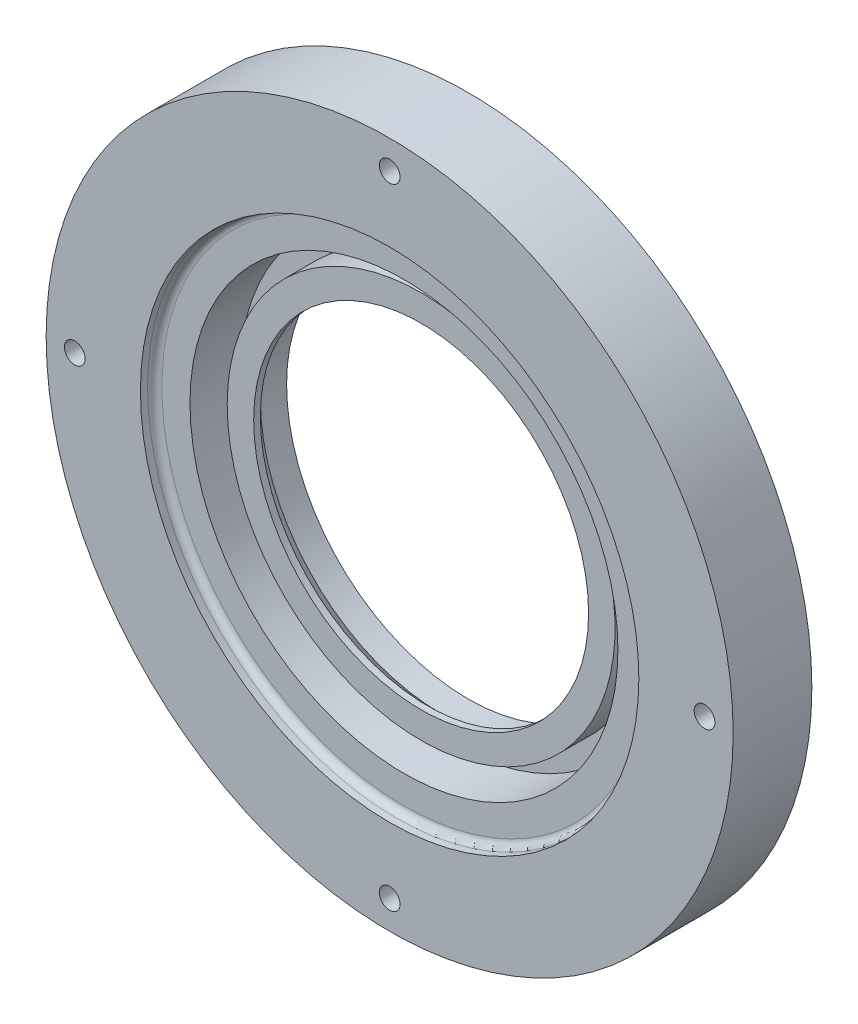
ISO-10303-21;
HEADER;
FILE_DESCRIPTION(('STEP AP214'),'2;1');
FILE_NAME('part.step','',(''),(''),'','','');
FILE_SCHEMA(('AUTOMOTIVE_DESIGN { 1 0 10303 214 1 1 1 1 }'));
ENDSEC;
DATA;
#1=APPLICATION_CONTEXT('core data for automotive mechanical design processes');
#2=APPLICATION_PROTOCOL_DEFINITION('international standard','automotive_design',2000,#1);
#3=PRODUCT_CONTEXT('',#1,'mechanical');
#4=PRODUCT('Part','Part','',(#3));
#5=PRODUCT_RELATED_PRODUCT_CATEGORY('part','',(#4));
#6=PRODUCT_DEFINITION_FORMATION('','',#4);
#7=PRODUCT_DEFINITION_CONTEXT('part definition',#1,'design');
#8=PRODUCT_DEFINITION('design','',#6,#7);
#9=PRODUCT_DEFINITION_SHAPE('','',#8);
#10=(LENGTH_UNIT() NAMED_UNIT(*) SI_UNIT(.MILLI.,.METRE.));
#11=(NAMED_UNIT(*) PLANE_ANGLE_UNIT() SI_UNIT($,.RADIAN.));
#12=(NAMED_UNIT(*) SI_UNIT($,.STERADIAN.) SOLID_ANGLE_UNIT());
#13=UNCERTAINTY_MEASURE_WITH_UNIT(LENGTH_MEASURE(1.E-05),#10,'distance_accuracy_value','');
#14=(GEOMETRIC_REPRESENTATION_CONTEXT(3) GLOBAL_UNCERTAINTY_ASSIGNED_CONTEXT((#13)) GLOBAL_UNIT_ASSIGNED_CONTEXT((#10,
#11,#12)) REPRESENTATION_CONTEXT('',''));
#15=CARTESIAN_POINT('',(0.,0.,0.));
#16=DIRECTION('',(0.,0.,1.));
#17=DIRECTION('',(1.,0.,0.));
#18=AXIS2_PLACEMENT_3D('',#15,#16,#17);
#19=CARTESIAN_POINT('',(127.528436791255,216.657330079598,-144.929295826493));
#20=DIRECTION('',(0.,0.,1.));
#21=DIRECTION('',(1.,0.,0.));
#22=AXIS2_PLACEMENT_3D('',#19,#20,#21);
#23=PLANE('',#22);
#24=CARTESIAN_POINT('',(149.116436893732,233.0392790349,-144.929295826493));
#25=DIRECTION('',(0.,0.,-1.));
#26=DIRECTION('',(-1.,0.,0.));
#27=AXIS2_PLACEMENT_3D('',#24,#25,#26);
#28=CIRCLE('',#27,23.3999999999755);
#29=CARTESIAN_POINT('',(125.716436893756,233.0392790349,-144.929295826493));
#30=VERTEX_POINT('',#29);
#31=EDGE_CURVE('E42',#30,#30,#28,.T.);
#32=ORIENTED_EDGE('',*,*,#31,.T.);
#33=EDGE_LOOP('',(#32));
#34=FACE_BOUND('',#33,.T.);
#35=CARTESIAN_POINT('',(149.116436893732,233.0392790349,-144.929295826493));
#36=DIRECTION('',(0.,0.,-1.));
#37=DIRECTION('',(-1.,0.,0.));
#38=AXIS2_PLACEMENT_3D('',#35,#36,#37);
#39=CIRCLE('',#38,27.0999999999755);
#40=CARTESIAN_POINT('',(122.016436893756,233.0392790349,-144.929295826493));
#41=VERTEX_POINT('',#40);
#42=EDGE_CURVE('E75',#41,#41,#39,.T.);
#43=ORIENTED_EDGE('',*,*,#42,.F.);
#44=EDGE_LOOP('',(#43));
#45=FACE_BOUND('',#44,.T.);
#46=ADVANCED_FACE('F31',(#34,#45),#23,.T.);
#47=CARTESIAN_POINT('',(149.116436893732,233.0392790349,-155.970002236656));
#48=DIRECTION('',(0.,0.,-1.));
#49=DIRECTION('',(-1.,0.,0.));
#50=AXIS2_PLACEMENT_3D('',#47,#48,#49);
#51=CYLINDRICAL_SURFACE('',#50,23.3999999999755);
#52=CARTESIAN_POINT('',(149.116436893732,233.0392790349,-145.863610401519));
#53=DIRECTION('',(0.,0.,-1.));
#54=DIRECTION('',(-1.,0.,0.));
#55=AXIS2_PLACEMENT_3D('',#52,#53,#54);
#56=CIRCLE('',#55,23.3999999999755);
#57=CARTESIAN_POINT('',(125.716436893756,233.0392790349,-145.863610401519));
#58=VERTEX_POINT('',#57);
#59=EDGE_CURVE('E46',#58,#58,#56,.T.);
#60=ORIENTED_EDGE('',*,*,#59,.T.);
#61=EDGE_LOOP('',(#60));
#62=FACE_BOUND('',#61,.T.);
#63=ORIENTED_EDGE('',*,*,#31,.F.);
#64=EDGE_LOOP('',(#63));
#65=FACE_BOUND('',#64,.T.);
#66=ADVANCED_FACE('F153',(#62,#65),#51,.F.);
#67=CARTESIAN_POINT('',(149.116436893732,233.0392790349,-145.863610401519));
#68=DIRECTION('',(0.,0.,-1.));
#69=DIRECTION('',(-1.,0.,0.));
#70=AXIS2_PLACEMENT_3D('',#67,#68,#69);
#71=CONICAL_SURFACE('',#70,23.3999999999755,0.785398163397448);
#72=CARTESIAN_POINT('',(149.116436893732,233.0392790349,-147.863610401544));
#73=DIRECTION('',(0.,0.,-1.));
#74=DIRECTION('',(-1.,0.,0.));
#75=AXIS2_PLACEMENT_3D('',#72,#73,#74);
#76=CIRCLE('',#75,25.4);
#77=CARTESIAN_POINT('',(123.716436893732,233.0392790349,-147.863610401544));
#78=VERTEX_POINT('',#77);
#79=EDGE_CURVE('E51',#78,#78,#76,.T.);
#80=ORIENTED_EDGE('',*,*,#79,.T.);
#81=EDGE_LOOP('',(#80));
#82=FACE_BOUND('',#81,.T.);
#83=ORIENTED_EDGE('',*,*,#59,.F.);
#84=EDGE_LOOP('',(#83));
#85=FACE_BOUND('',#84,.T.);
#86=ADVANCED_FACE('F147',(#82,#85),#71,.F.);
#87=CARTESIAN_POINT('',(149.116436893732,233.0392790349,-155.970002236656));
#88=DIRECTION('',(0.,0.,-1.));
#89=DIRECTION('',(-1.,0.,0.));
#90=AXIS2_PLACEMENT_3D('',#87,#88,#89);
#91=CYLINDRICAL_SURFACE('',#90,25.4);
#92=CARTESIAN_POINT('',(149.116436893732,233.0392790349,-151.529295826493));
#93=DIRECTION('',(0.,0.,-1.));
#94=DIRECTION('',(-1.,0.,0.));
#95=AXIS2_PLACEMENT_3D('',#92,#93,#94);
#96=CIRCLE('',#95,25.4);
#97=CARTESIAN_POINT('',(123.716436893732,233.0392790349,-151.529295826493));
#98=VERTEX_POINT('',#97);
#99=EDGE_CURVE('E54',#98,#98,#96,.T.);
#100=ORIENTED_EDGE('',*,*,#99,.T.);
#101=EDGE_LOOP('',(#100));
#102=FACE_BOUND('',#101,.T.);
#103=ORIENTED_EDGE('',*,*,#79,.F.);
#104=EDGE_LOOP('',(#103));
#105=FACE_BOUND('',#104,.T.);
#106=ADVANCED_FACE('F133',(#102,#105),#91,.F.);
#107=CARTESIAN_POINT('',(128.882665579953,217.68498001405,-151.529295826493));
#108=DIRECTION('',(0.,0.,-1.));
#109=DIRECTION('',(-1.,0.,0.));
#110=AXIS2_PLACEMENT_3D('',#107,#108,#109);
#111=PLANE('',#110);
#112=CARTESIAN_POINT('',(149.116436893732,277.0392790349,-151.529295826493));
#113=DIRECTION('',(0.,0.,-1.));
#114=DIRECTION('',(-1.,0.,0.));
#115=AXIS2_PLACEMENT_3D('',#112,#113,#114);
#116=CIRCLE('',#115,2.75);
#117=CARTESIAN_POINT('',(146.366436893732,277.0392790349,-151.529295826493));
#118=VERTEX_POINT('',#117);
#119=EDGE_CURVE('E123',#118,#118,#116,.T.);
#120=ORIENTED_EDGE('',*,*,#119,.F.);
#121=EDGE_LOOP('',(#120));
#122=FACE_BOUND('',#121,.T.);
#123=CARTESIAN_POINT('',(149.116436893732,189.0392790349,-151.529295826493));
#124=DIRECTION('',(0.,0.,-1.));
#125=DIRECTION('',(-1.,0.,0.));
#126=AXIS2_PLACEMENT_3D('',#123,#124,#125);
#127=CIRCLE('',#126,2.75);
#128=CARTESIAN_POINT('',(146.366436893732,189.0392790349,-151.529295826493));
#129=VERTEX_POINT('',#128);
#130=EDGE_CURVE('E111',#129,#129,#127,.T.);
#131=ORIENTED_EDGE('',*,*,#130,.F.);
#132=EDGE_LOOP('',(#131));
#133=FACE_BOUND('',#132,.T.);
#134=CARTESIAN_POINT('',(105.116436893732,233.0392790349,-151.529295826493));
#135=DIRECTION('',(0.,0.,-1.));
#136=DIRECTION('',(-1.,0.,0.));
#137=AXIS2_PLACEMENT_3D('',#134,#135,#136);
#138=CIRCLE('',#137,2.75);
#139=CARTESIAN_POINT('',(102.366436893732,233.0392790349,-151.529295826493));
#140=VERTEX_POINT('',#139);
#141=EDGE_CURVE('E99',#140,#140,#138,.T.);
#142=ORIENTED_EDGE('',*,*,#141,.F.);
#143=EDGE_LOOP('',(#142));
#144=FACE_BOUND('',#143,.T.);
#145=CARTESIAN_POINT('',(193.116436893732,233.0392790349,-151.529295826493));
#146=DIRECTION('',(0.,0.,-1.));
#147=DIRECTION('',(-1.,0.,0.));
#148=AXIS2_PLACEMENT_3D('',#145,#146,#147);
#149=CIRCLE('',#148,2.75);
#150=CARTESIAN_POINT('',(190.366436893732,233.0392790349,-151.529295826493));
#151=VERTEX_POINT('',#150);
#152=EDGE_CURVE('E87',#151,#151,#149,.T.);
#153=ORIENTED_EDGE('',*,*,#152,.F.);
#154=EDGE_LOOP('',(#153));
#155=FACE_BOUND('',#154,.T.);
#156=CARTESIAN_POINT('',(149.116436893732,233.0392790349,-151.529295826493));
#157=DIRECTION('',(0.,0.,-1.));
#158=DIRECTION('',(-1.,0.,0.));
#159=AXIS2_PLACEMENT_3D('',#156,#157,#158);
#160=CIRCLE('',#159,48.);
#161=CARTESIAN_POINT('',(101.116436893732,233.0392790349,-151.529295826493));
#162=VERTEX_POINT('',#161);
#163=EDGE_CURVE('E57',#162,#162,#160,.T.);
#164=ORIENTED_EDGE('',*,*,#163,.T.);
#165=EDGE_LOOP('',(#164));
#166=FACE_BOUND('',#165,.T.);
#167=ORIENTED_EDGE('',*,*,#99,.F.);
#168=EDGE_LOOP('',(#167));
#169=FACE_BOUND('',#168,.T.);
#170=ADVANCED_FACE('F129',(#122,#133,#144,#155,#166,#169),#111,.T.);
#171=CARTESIAN_POINT('',(149.116436893732,233.0392790349,-155.970002236656));
#172=DIRECTION('',(0.,0.,-1.));
#173=DIRECTION('',(-1.,0.,0.));
#174=AXIS2_PLACEMENT_3D('',#171,#172,#173);
#175=CYLINDRICAL_SURFACE('',#174,48.);
#176=CARTESIAN_POINT('',(149.116436893732,233.0392790349,-140.529295826493));
#177=DIRECTION('',(0.,0.,-1.));
#178=DIRECTION('',(-1.,0.,0.));
#179=AXIS2_PLACEMENT_3D('',#176,#177,#178);
#180=CIRCLE('',#179,48.);
#181=CARTESIAN_POINT('',(101.116436893732,233.0392790349,-140.529295826493));
#182=VERTEX_POINT('',#181);
#183=EDGE_CURVE('E60',#182,#182,#180,.T.);
#184=ORIENTED_EDGE('',*,*,#183,.T.);
#185=EDGE_LOOP('',(#184));
#186=FACE_BOUND('',#185,.T.);
#187=ORIENTED_EDGE('',*,*,#163,.F.);
#188=EDGE_LOOP('',(#187));
#189=FACE_BOUND('',#188,.T.);
#190=ADVANCED_FACE('F132',(#186,#189),#175,.T.);
#191=CARTESIAN_POINT('',(110.879388741709,204.023280885261,-140.529295826493));
#192=DIRECTION('',(0.,0.,1.));
#193=DIRECTION('',(1.,0.,0.));
#194=AXIS2_PLACEMENT_3D('',#191,#192,#193);
#195=PLANE('',#194);
#196=CARTESIAN_POINT('',(149.116436893732,277.0392790349,-140.529295826493));
#197=DIRECTION('',(0.,0.,-1.));
#198=DIRECTION('',(-1.,0.,0.));
#199=AXIS2_PLACEMENT_3D('',#196,#197,#198);
#200=CIRCLE('',#199,1.45000000000001);
#201=CARTESIAN_POINT('',(147.666436893732,277.0392790349,-140.529295826493));
#202=VERTEX_POINT('',#201);
#203=EDGE_CURVE('E114',#202,#202,#200,.T.);
#204=ORIENTED_EDGE('',*,*,#203,.T.);
#205=EDGE_LOOP('',(#204));
#206=FACE_BOUND('',#205,.T.);
#207=CARTESIAN_POINT('',(149.116436893732,189.0392790349,-140.529295826493));
#208=DIRECTION('',(0.,0.,-1.));
#209=DIRECTION('',(-1.,0.,0.));
#210=AXIS2_PLACEMENT_3D('',#207,#208,#209);
#211=CIRCLE('',#210,1.45000000000001);
#212=CARTESIAN_POINT('',(147.666436893732,189.0392790349,-140.529295826493));
#213=VERTEX_POINT('',#212);
#214=EDGE_CURVE('E102',#213,#213,#211,.T.);
#215=ORIENTED_EDGE('',*,*,#214,.T.);
#216=EDGE_LOOP('',(#215));
#217=FACE_BOUND('',#216,.T.);
#218=CARTESIAN_POINT('',(105.116436893732,233.0392790349,-140.529295826493));
#219=DIRECTION('',(0.,0.,-1.));
#220=DIRECTION('',(-1.,0.,0.));
#221=AXIS2_PLACEMENT_3D('',#218,#219,#220);
#222=CIRCLE('',#221,1.44999999999999);
#223=CARTESIAN_POINT('',(103.666436893732,233.0392790349,-140.529295826493));
#224=VERTEX_POINT('',#223);
#225=EDGE_CURVE('E90',#224,#224,#222,.T.);
#226=ORIENTED_EDGE('',*,*,#225,.T.);
#227=EDGE_LOOP('',(#226));
#228=FACE_BOUND('',#227,.T.);
#229=CARTESIAN_POINT('',(193.116436893732,233.0392790349,-140.529295826493));
#230=DIRECTION('',(0.,0.,-1.));
#231=DIRECTION('',(-1.,0.,0.));
#232=AXIS2_PLACEMENT_3D('',#229,#230,#231);
#233=CIRCLE('',#232,1.45000000000001);
#234=CARTESIAN_POINT('',(191.666436893732,233.0392790349,-140.529295826493));
#235=VERTEX_POINT('',#234);
#236=EDGE_CURVE('E78',#235,#235,#233,.T.);
#237=ORIENTED_EDGE('',*,*,#236,.T.);
#238=EDGE_LOOP('',(#237));
#239=FACE_BOUND('',#238,.T.);
#240=CARTESIAN_POINT('',(149.116436893732,233.0392790349,-140.529295826493));
#241=DIRECTION('',(0.,0.,-1.));
#242=DIRECTION('',(-1.,0.,0.));
#243=AXIS2_PLACEMENT_3D('',#240,#241,#242);
#244=CIRCLE('',#243,34.825);
#245=CARTESIAN_POINT('',(114.291436893732,233.0392790349,-140.529295826493));
#246=VERTEX_POINT('',#245);
#247=EDGE_CURVE('E63',#246,#246,#244,.T.);
#248=ORIENTED_EDGE('',*,*,#247,.T.);
#249=EDGE_LOOP('',(#248));
#250=FACE_BOUND('',#249,.T.);
#251=ORIENTED_EDGE('',*,*,#183,.F.);
#252=EDGE_LOOP('',(#251));
#253=FACE_BOUND('',#252,.T.);
#254=ADVANCED_FACE('F191',(#206,#217,#228,#239,#250,#253),#195,.T.);
#255=CARTESIAN_POINT('',(149.116436893732,233.0392790349,-155.970002236656));
#256=DIRECTION('',(0.,0.,-1.));
#257=DIRECTION('',(-1.,0.,0.));
#258=AXIS2_PLACEMENT_3D('',#255,#256,#257);
#259=CYLINDRICAL_SURFACE('',#258,34.825);
#260=CARTESIAN_POINT('',(149.116436893732,233.0392790349,-141.529295826493));
#261=DIRECTION('',(0.,0.,1.));
#262=DIRECTION('',(1.,0.,0.));
#263=AXIS2_PLACEMENT_3D('',#260,#261,#262);
#264=CIRCLE('',#263,34.825);
#265=CARTESIAN_POINT('',(183.941436893732,233.0392790349,-141.529295826493));
#266=VERTEX_POINT('',#265);
#267=EDGE_CURVE('E38',#266,#266,#264,.F.);
#268=ORIENTED_EDGE('',*,*,#267,.T.);
#269=EDGE_LOOP('',(#268));
#270=FACE_BOUND('',#269,.T.);
#271=ORIENTED_EDGE('',*,*,#247,.F.);
#272=EDGE_LOOP('',(#271));
#273=FACE_BOUND('',#272,.T.);
#274=ADVANCED_FACE('F186',(#270,#273),#259,.F.);
#275=CARTESIAN_POINT('',(121.374661854269,211.987567877376,-142.529295826493));
#276=DIRECTION('',(0.,0.,1.));
#277=DIRECTION('',(1.,0.,0.));
#278=AXIS2_PLACEMENT_3D('',#275,#276,#277);
#279=PLANE('',#278);
#280=CARTESIAN_POINT('',(149.116436893732,233.0392790349,-142.529295826493));
#281=DIRECTION('',(0.,0.,1.));
#282=DIRECTION('',(1.,0.,0.));
#283=AXIS2_PLACEMENT_3D('',#280,#281,#282);
#284=CIRCLE('',#283,33.825);
#285=CARTESIAN_POINT('',(182.941436893732,233.0392790349,-142.529295826493));
#286=VERTEX_POINT('',#285);
#287=EDGE_CURVE('E10',#286,#286,#284,.T.);
#288=ORIENTED_EDGE('',*,*,#287,.T.);
#289=EDGE_LOOP('',(#288));
#290=FACE_BOUND('',#289,.T.);
#291=CARTESIAN_POINT('',(149.116436893732,233.0392790349,-142.529295826493));
#292=DIRECTION('',(0.,0.,-1.));
#293=DIRECTION('',(-1.,0.,0.));
#294=AXIS2_PLACEMENT_3D('',#291,#292,#293);
#295=CIRCLE('',#294,29.8999999999755);
#296=CARTESIAN_POINT('',(119.216436893756,233.0392790349,-142.529295826493));
#297=VERTEX_POINT('',#296);
#298=EDGE_CURVE('E66',#297,#297,#295,.T.);
#299=ORIENTED_EDGE('',*,*,#298,.T.);
#300=EDGE_LOOP('',(#299));
#301=FACE_BOUND('',#300,.T.);
#302=ADVANCED_FACE('F181',(#290,#301),#279,.T.);
#303=CARTESIAN_POINT('',(149.116436893732,233.0392790349,-155.970002236656));
#304=DIRECTION('',(0.,0.,-1.));
#305=DIRECTION('',(-1.,0.,0.));
#306=AXIS2_PLACEMENT_3D('',#303,#304,#305);
#307=CYLINDRICAL_SURFACE('',#306,29.8999999999755);
#308=CARTESIAN_POINT('',(149.116436893732,233.0392790349,-149.529295826493));
#309=DIRECTION('',(0.,0.,-1.));
#310=DIRECTION('',(-1.,0.,0.));
#311=AXIS2_PLACEMENT_3D('',#308,#309,#310);
#312=CIRCLE('',#311,29.8999999999755);
#313=CARTESIAN_POINT('',(119.216436893756,233.0392790349,-149.529295826493));
#314=VERTEX_POINT('',#313);
#315=EDGE_CURVE('E69',#314,#314,#312,.T.);
#316=ORIENTED_EDGE('',*,*,#315,.T.);
#317=EDGE_LOOP('',(#316));
#318=FACE_BOUND('',#317,.T.);
#319=ORIENTED_EDGE('',*,*,#298,.F.);
#320=EDGE_LOOP('',(#319));
#321=FACE_BOUND('',#320,.T.);
#322=ADVANCED_FACE('F175',(#318,#321),#307,.F.);
#323=CARTESIAN_POINT('',(127.528436791255,216.657330079598,-149.529295826493));
#324=DIRECTION('',(0.,0.,1.));
#325=DIRECTION('',(1.,0.,0.));
#326=AXIS2_PLACEMENT_3D('',#323,#324,#325);
#327=PLANE('',#326);
#328=CARTESIAN_POINT('',(149.116436893732,233.0392790349,-149.529295826493));
#329=DIRECTION('',(0.,0.,-1.));
#330=DIRECTION('',(-1.,0.,0.));
#331=AXIS2_PLACEMENT_3D('',#328,#329,#330);
#332=CIRCLE('',#331,27.0999999999755);
#333=CARTESIAN_POINT('',(122.016436893756,233.0392790349,-149.529295826493));
#334=VERTEX_POINT('',#333);
#335=EDGE_CURVE('E72',#334,#334,#332,.T.);
#336=ORIENTED_EDGE('',*,*,#335,.T.);
#337=EDGE_LOOP('',(#336));
#338=FACE_BOUND('',#337,.T.);
#339=ORIENTED_EDGE('',*,*,#315,.F.);
#340=EDGE_LOOP('',(#339));
#341=FACE_BOUND('',#340,.T.);
#342=ADVANCED_FACE('F169',(#338,#341),#327,.T.);
#343=CARTESIAN_POINT('',(149.116436893732,233.0392790349,-155.970002236656));
#344=DIRECTION('',(0.,0.,-1.));
#345=DIRECTION('',(-1.,0.,0.));
#346=AXIS2_PLACEMENT_3D('',#343,#344,#345);
#347=CYLINDRICAL_SURFACE('',#346,27.0999999999755);
#348=ORIENTED_EDGE('',*,*,#42,.T.);
#349=EDGE_LOOP('',(#348));
#350=FACE_BOUND('',#349,.T.);
#351=ORIENTED_EDGE('',*,*,#335,.F.);
#352=EDGE_LOOP('',(#351));
#353=FACE_BOUND('',#352,.T.);
#354=ADVANCED_FACE('F166',(#350,#353),#347,.T.);
#355=CARTESIAN_POINT('',(149.116436893732,233.0392790349,-141.529295826493));
#356=DIRECTION('',(0.,0.,1.));
#357=DIRECTION('',(1.,0.,0.));
#358=AXIS2_PLACEMENT_3D('',#355,#356,#357);
#359=TOROIDAL_SURFACE('',#358,33.825,1.);
#360=ORIENTED_EDGE('',*,*,#287,.F.);
#361=EDGE_LOOP('',(#360));
#362=FACE_BOUND('',#361,.T.);
#363=ORIENTED_EDGE('',*,*,#267,.F.);
#364=EDGE_LOOP('',(#363));
#365=FACE_BOUND('',#364,.T.);
#366=ADVANCED_FACE('F33',(#362,#365),#359,.F.);
#367=CARTESIAN_POINT('',(193.116436893732,233.0392790349,-151.529295826493));
#368=DIRECTION('',(0.,0.,-1.));
#369=DIRECTION('',(-1.,0.,0.));
#370=AXIS2_PLACEMENT_3D('',#367,#368,#369);
#371=CYLINDRICAL_SURFACE('',#370,1.45000000000001);
#372=ORIENTED_EDGE('',*,*,#236,.F.);
#373=EDGE_LOOP('',(#372));
#374=FACE_BOUND('',#373,.T.);
#375=CARTESIAN_POINT('',(193.116436893732,233.0392790349,-146.029295826493));
#376=DIRECTION('',(0.,0.,-1.));
#377=DIRECTION('',(-1.,0.,0.));
#378=AXIS2_PLACEMENT_3D('',#375,#376,#377);
#379=CIRCLE('',#378,1.45000000000001);
#380=CARTESIAN_POINT('',(191.666436893732,233.0392790349,-146.029295826493));
#381=VERTEX_POINT('',#380);
#382=EDGE_CURVE('E81',#381,#381,#379,.T.);
#383=ORIENTED_EDGE('',*,*,#382,.T.);
#384=EDGE_LOOP('',(#383));
#385=FACE_BOUND('',#384,.T.);
#386=ADVANCED_FACE('F234',(#374,#385),#371,.F.);
#387=CARTESIAN_POINT('',(194.566436893732,233.0392790349,-146.029295826493));
#388=DIRECTION('',(0.,0.,1.));
#389=DIRECTION('',(1.,0.,0.));
#390=AXIS2_PLACEMENT_3D('',#387,#388,#389);
#391=PLANE('',#390);
#392=ORIENTED_EDGE('',*,*,#382,.F.);
#393=EDGE_LOOP('',(#392));
#394=FACE_BOUND('',#393,.T.);
#395=CARTESIAN_POINT('',(193.116436893732,233.0392790349,-146.029295826493));
#396=DIRECTION('',(0.,0.,-1.));
#397=DIRECTION('',(-1.,0.,0.));
#398=AXIS2_PLACEMENT_3D('',#395,#396,#397);
#399=CIRCLE('',#398,2.75);
#400=CARTESIAN_POINT('',(190.366436893732,233.0392790349,-146.029295826493));
#401=VERTEX_POINT('',#400);
#402=EDGE_CURVE('E84',#401,#401,#399,.T.);
#403=ORIENTED_EDGE('',*,*,#402,.T.);
#404=EDGE_LOOP('',(#403));
#405=FACE_BOUND('',#404,.T.);
#406=ADVANCED_FACE('F275',(#394,#405),#391,.F.);
#407=CARTESIAN_POINT('',(193.116436893732,233.0392790349,-151.529295826493));
#408=DIRECTION('',(0.,0.,-1.));
#409=DIRECTION('',(-1.,0.,0.));
#410=AXIS2_PLACEMENT_3D('',#407,#408,#409);
#411=CYLINDRICAL_SURFACE('',#410,2.75);
#412=ORIENTED_EDGE('',*,*,#402,.F.);
#413=EDGE_LOOP('',(#412));
#414=FACE_BOUND('',#413,.T.);
#415=ORIENTED_EDGE('',*,*,#152,.T.);
#416=EDGE_LOOP('',(#415));
#417=FACE_BOUND('',#416,.T.);
#418=ADVANCED_FACE('F282',(#414,#417),#411,.F.);
#419=CARTESIAN_POINT('',(105.116436893732,233.0392790349,-151.529295826493));
#420=DIRECTION('',(0.,0.,-1.));
#421=DIRECTION('',(-1.,0.,0.));
#422=AXIS2_PLACEMENT_3D('',#419,#420,#421);
#423=CYLINDRICAL_SURFACE('',#422,1.44999999999999);
#424=ORIENTED_EDGE('',*,*,#225,.F.);
#425=EDGE_LOOP('',(#424));
#426=FACE_BOUND('',#425,.T.);
#427=CARTESIAN_POINT('',(105.116436893732,233.0392790349,-146.029295826493));
#428=DIRECTION('',(0.,0.,-1.));
#429=DIRECTION('',(-1.,0.,0.));
#430=AXIS2_PLACEMENT_3D('',#427,#428,#429);
#431=CIRCLE('',#430,1.44999999999999);
#432=CARTESIAN_POINT('',(103.666436893732,233.0392790349,-146.029295826493));
#433=VERTEX_POINT('',#432);
#434=EDGE_CURVE('E93',#433,#433,#431,.T.);
#435=ORIENTED_EDGE('',*,*,#434,.T.);
#436=EDGE_LOOP('',(#435));
#437=FACE_BOUND('',#436,.T.);
#438=ADVANCED_FACE('F290',(#426,#437),#423,.F.);
#439=CARTESIAN_POINT('',(106.566436893732,233.0392790349,-146.029295826493));
#440=DIRECTION('',(0.,0.,1.));
#441=DIRECTION('',(1.,0.,0.));
#442=AXIS2_PLACEMENT_3D('',#439,#440,#441);
#443=PLANE('',#442);
#444=ORIENTED_EDGE('',*,*,#434,.F.);
#445=EDGE_LOOP('',(#444));
#446=FACE_BOUND('',#445,.T.);
#447=CARTESIAN_POINT('',(105.116436893732,233.0392790349,-146.029295826493));
#448=DIRECTION('',(0.,0.,-1.));
#449=DIRECTION('',(-1.,0.,0.));
#450=AXIS2_PLACEMENT_3D('',#447,#448,#449);
#451=CIRCLE('',#450,2.75);
#452=CARTESIAN_POINT('',(102.366436893732,233.0392790349,-146.029295826493));
#453=VERTEX_POINT('',#452);
#454=EDGE_CURVE('E96',#453,#453,#451,.T.);
#455=ORIENTED_EDGE('',*,*,#454,.T.);
#456=EDGE_LOOP('',(#455));
#457=FACE_BOUND('',#456,.T.);
#458=ADVANCED_FACE('F298',(#446,#457),#443,.F.);
#459=CARTESIAN_POINT('',(105.116436893732,233.0392790349,-151.529295826493));
#460=DIRECTION('',(0.,0.,-1.));
#461=DIRECTION('',(-1.,0.,0.));
#462=AXIS2_PLACEMENT_3D('',#459,#460,#461);
#463=CYLINDRICAL_SURFACE('',#462,2.75);
#464=ORIENTED_EDGE('',*,*,#454,.F.);
#465=EDGE_LOOP('',(#464));
#466=FACE_BOUND('',#465,.T.);
#467=ORIENTED_EDGE('',*,*,#141,.T.);
#468=EDGE_LOOP('',(#467));
#469=FACE_BOUND('',#468,.T.);
#470=ADVANCED_FACE('F306',(#466,#469),#463,.F.);
#471=CARTESIAN_POINT('',(149.116436893732,189.0392790349,-151.529295826493));
#472=DIRECTION('',(0.,0.,-1.));
#473=DIRECTION('',(-1.,0.,0.));
#474=AXIS2_PLACEMENT_3D('',#471,#472,#473);
#475=CYLINDRICAL_SURFACE('',#474,1.45000000000001);
#476=ORIENTED_EDGE('',*,*,#214,.F.);
#477=EDGE_LOOP('',(#476));
#478=FACE_BOUND('',#477,.T.);
#479=CARTESIAN_POINT('',(149.116436893732,189.0392790349,-146.029295826493));
#480=DIRECTION('',(0.,0.,-1.));
#481=DIRECTION('',(-1.,0.,0.));
#482=AXIS2_PLACEMENT_3D('',#479,#480,#481);
#483=CIRCLE('',#482,1.45000000000001);
#484=CARTESIAN_POINT('',(147.666436893732,189.0392790349,-146.029295826493));
#485=VERTEX_POINT('',#484);
#486=EDGE_CURVE('E105',#485,#485,#483,.T.);
#487=ORIENTED_EDGE('',*,*,#486,.T.);
#488=EDGE_LOOP('',(#487));
#489=FACE_BOUND('',#488,.T.);
#490=ADVANCED_FACE('F314',(#478,#489),#475,.F.);
#491=CARTESIAN_POINT('',(150.566436893732,189.0392790349,-146.029295826493));
#492=DIRECTION('',(0.,0.,1.));
#493=DIRECTION('',(1.,0.,0.));
#494=AXIS2_PLACEMENT_3D('',#491,#492,#493);
#495=PLANE('',#494);
#496=ORIENTED_EDGE('',*,*,#486,.F.);
#497=EDGE_LOOP('',(#496));
#498=FACE_BOUND('',#497,.T.);
#499=CARTESIAN_POINT('',(149.116436893732,189.0392790349,-146.029295826493));
#500=DIRECTION('',(0.,0.,-1.));
#501=DIRECTION('',(-1.,0.,0.));
#502=AXIS2_PLACEMENT_3D('',#499,#500,#501);
#503=CIRCLE('',#502,2.75);
#504=CARTESIAN_POINT('',(146.366436893732,189.0392790349,-146.029295826493));
#505=VERTEX_POINT('',#504);
#506=EDGE_CURVE('E108',#505,#505,#503,.T.);
#507=ORIENTED_EDGE('',*,*,#506,.T.);
#508=EDGE_LOOP('',(#507));
#509=FACE_BOUND('',#508,.T.);
#510=ADVANCED_FACE('F322',(#498,#509),#495,.F.);
#511=CARTESIAN_POINT('',(149.116436893732,189.0392790349,-151.529295826493));
#512=DIRECTION('',(0.,0.,-1.));
#513=DIRECTION('',(-1.,0.,0.));
#514=AXIS2_PLACEMENT_3D('',#511,#512,#513);
#515=CYLINDRICAL_SURFACE('',#514,2.75);
#516=ORIENTED_EDGE('',*,*,#506,.F.);
#517=EDGE_LOOP('',(#516));
#518=FACE_BOUND('',#517,.T.);
#519=ORIENTED_EDGE('',*,*,#130,.T.);
#520=EDGE_LOOP('',(#519));
#521=FACE_BOUND('',#520,.T.);
#522=ADVANCED_FACE('F330',(#518,#521),#515,.F.);
#523=CARTESIAN_POINT('',(149.116436893732,277.0392790349,-151.529295826493));
#524=DIRECTION('',(0.,0.,-1.));
#525=DIRECTION('',(-1.,0.,0.));
#526=AXIS2_PLACEMENT_3D('',#523,#524,#525);
#527=CYLINDRICAL_SURFACE('',#526,1.45000000000001);
#528=ORIENTED_EDGE('',*,*,#203,.F.);
#529=EDGE_LOOP('',(#528));
#530=FACE_BOUND('',#529,.T.);
#531=CARTESIAN_POINT('',(149.116436893732,277.0392790349,-146.029295826493));
#532=DIRECTION('',(0.,0.,-1.));
#533=DIRECTION('',(-1.,0.,0.));
#534=AXIS2_PLACEMENT_3D('',#531,#532,#533);
#535=CIRCLE('',#534,1.45000000000001);
#536=CARTESIAN_POINT('',(147.666436893732,277.0392790349,-146.029295826493));
#537=VERTEX_POINT('',#536);
#538=EDGE_CURVE('E117',#537,#537,#535,.T.);
#539=ORIENTED_EDGE('',*,*,#538,.T.);
#540=EDGE_LOOP('',(#539));
#541=FACE_BOUND('',#540,.T.);
#542=ADVANCED_FACE('F338',(#530,#541),#527,.F.);
#543=CARTESIAN_POINT('',(150.566436893732,277.0392790349,-146.029295826493));
#544=DIRECTION('',(0.,0.,1.));
#545=DIRECTION('',(1.,0.,0.));
#546=AXIS2_PLACEMENT_3D('',#543,#544,#545);
#547=PLANE('',#546);
#548=ORIENTED_EDGE('',*,*,#538,.F.);
#549=EDGE_LOOP('',(#548));
#550=FACE_BOUND('',#549,.T.);
#551=CARTESIAN_POINT('',(149.116436893732,277.0392790349,-146.029295826493));
#552=DIRECTION('',(0.,0.,-1.));
#553=DIRECTION('',(-1.,0.,0.));
#554=AXIS2_PLACEMENT_3D('',#551,#552,#553);
#555=CIRCLE('',#554,2.75);
#556=CARTESIAN_POINT('',(146.366436893732,277.0392790349,-146.029295826493));
#557=VERTEX_POINT('',#556);
#558=EDGE_CURVE('E120',#557,#557,#555,.T.);
#559=ORIENTED_EDGE('',*,*,#558,.T.);
#560=EDGE_LOOP('',(#559));
#561=FACE_BOUND('',#560,.T.);
#562=ADVANCED_FACE('F346',(#550,#561),#547,.F.);
#563=CARTESIAN_POINT('',(149.116436893732,277.0392790349,-151.529295826493));
#564=DIRECTION('',(0.,0.,-1.));
#565=DIRECTION('',(-1.,0.,0.));
#566=AXIS2_PLACEMENT_3D('',#563,#564,#565);
#567=CYLINDRICAL_SURFACE('',#566,2.75);
#568=ORIENTED_EDGE('',*,*,#558,.F.);
#569=EDGE_LOOP('',(#568));
#570=FACE_BOUND('',#569,.T.);
#571=ORIENTED_EDGE('',*,*,#119,.T.);
#572=EDGE_LOOP('',(#571));
#573=FACE_BOUND('',#572,.T.);
#574=ADVANCED_FACE('F127',(#570,#573),#567,.F.);
#575=CLOSED_SHELL('',(#46,#66,#86,#106,#170,#190,#254,#274,#302,#322,#342,#354,#366,#386,#406,
#418,#438,#458,#470,#490,#510,#522,#542,#562,#574));
#576=MANIFOLD_SOLID_BREP('B2',#575);
#577=ADVANCED_BREP_SHAPE_REPRESENTATION('',(#18,#576),#14);
#578=SHAPE_DEFINITION_REPRESENTATION(#9,#577);
ENDSEC;
END-ISO-10303-21;
